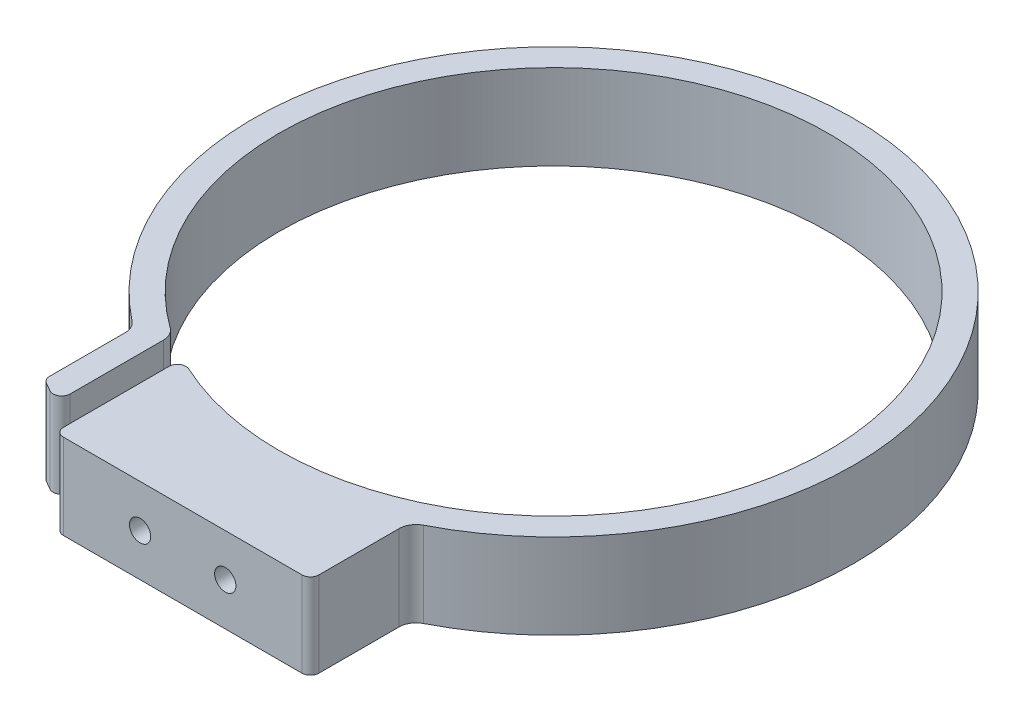
ISO-10303-21;
HEADER;
FILE_DESCRIPTION(('STEP AP214'),'2;1');
FILE_NAME('part.step','',(''),(''),'','','');
FILE_SCHEMA(('AUTOMOTIVE_DESIGN { 1 0 10303 214 1 1 1 1 }'));
ENDSEC;
DATA;
#1=APPLICATION_CONTEXT('core data for automotive mechanical design processes');
#2=APPLICATION_PROTOCOL_DEFINITION('international standard','automotive_design',2000,#1);
#3=PRODUCT_CONTEXT('',#1,'mechanical');
#4=PRODUCT('Part','Part','',(#3));
#5=PRODUCT_RELATED_PRODUCT_CATEGORY('part','',(#4));
#6=PRODUCT_DEFINITION_FORMATION('','',#4);
#7=PRODUCT_DEFINITION_CONTEXT('part definition',#1,'design');
#8=PRODUCT_DEFINITION('design','',#6,#7);
#9=PRODUCT_DEFINITION_SHAPE('','',#8);
#10=(LENGTH_UNIT() NAMED_UNIT(*) SI_UNIT(.MILLI.,.METRE.));
#11=(NAMED_UNIT(*) PLANE_ANGLE_UNIT() SI_UNIT($,.RADIAN.));
#12=(NAMED_UNIT(*) SI_UNIT($,.STERADIAN.) SOLID_ANGLE_UNIT());
#13=UNCERTAINTY_MEASURE_WITH_UNIT(LENGTH_MEASURE(1.E-05),#10,'distance_accuracy_value','');
#14=(GEOMETRIC_REPRESENTATION_CONTEXT(3) GLOBAL_UNCERTAINTY_ASSIGNED_CONTEXT((#13)) GLOBAL_UNIT_ASSIGNED_CONTEXT((#10,
#11,#12)) REPRESENTATION_CONTEXT('',''));
#15=CARTESIAN_POINT('',(0.,0.,0.));
#16=DIRECTION('',(0.,0.,1.));
#17=DIRECTION('',(1.,0.,0.));
#18=AXIS2_PLACEMENT_3D('',#15,#16,#17);
#19=CARTESIAN_POINT('',(0.,10.,0.));
#20=DIRECTION('',(0.,1.,0.));
#21=DIRECTION('',(0.,0.,1.));
#22=AXIS2_PLACEMENT_3D('',#19,#20,#21);
#23=PLANE('',#22);
#24=DIRECTION('',(1.,0.,0.));
#25=VECTOR('',#24,1.);
#26=CARTESIAN_POINT('',(-15.,10.,43.5492994660114));
#27=LINE('',#26,#25);
#28=CARTESIAN_POINT('',(-14.,10.,43.5492994660114));
#29=VERTEX_POINT('',#28);
#30=CARTESIAN_POINT('',(14.,10.,43.5492994660114));
#31=VERTEX_POINT('',#30);
#32=EDGE_CURVE('E213',#29,#31,#27,.T.);
#33=ORIENTED_EDGE('',*,*,#32,.T.);
#34=CARTESIAN_POINT('',(14.,10.,42.5492994660114));
#35=DIRECTION('',(0.,1.,0.));
#36=DIRECTION('',(0.,0.,1.));
#37=AXIS2_PLACEMENT_3D('',#34,#35,#36);
#38=CIRCLE('',#37,1.);
#39=CARTESIAN_POINT('',(15.,10.,42.5492994660114));
#40=VERTEX_POINT('',#39);
#41=EDGE_CURVE('E291',#31,#40,#38,.T.);
#42=ORIENTED_EDGE('',*,*,#41,.T.);
#43=DIRECTION('',(0.,0.,-1.));
#44=VECTOR('',#43,1.);
#45=CARTESIAN_POINT('',(15.,10.,43.5492994660114));
#46=LINE('',#45,#44);
#47=CARTESIAN_POINT('',(15.,10.,33.1445696909765));
#48=VERTEX_POINT('',#47);
#49=EDGE_CURVE('E216',#40,#48,#46,.T.);
#50=ORIENTED_EDGE('',*,*,#49,.T.);
#51=CARTESIAN_POINT('',(17.,10.,33.1445696909765));
#52=DIRECTION('',(0.,1.,0.));
#53=DIRECTION('',(0.,0.,1.));
#54=AXIS2_PLACEMENT_3D('',#51,#52,#53);
#55=CIRCLE('',#54,2.);
#56=CARTESIAN_POINT('',(16.0872483221477,10.,31.3649954793805));
#57=VERTEX_POINT('',#56);
#58=EDGE_CURVE('E261',#48,#57,#55,.F.);
#59=ORIENTED_EDGE('',*,*,#58,.T.);
#60=CARTESIAN_POINT('',(0.,10.,0.));
#61=DIRECTION('',(0.,1.,0.));
#62=DIRECTION('',(0.,0.,1.));
#63=AXIS2_PLACEMENT_3D('',#60,#61,#62);
#64=CIRCLE('',#63,35.25);
#65=CARTESIAN_POINT('',(-21.7651006711409,10.,27.728016387313));
#66=VERTEX_POINT('',#65);
#67=EDGE_CURVE('E219',#57,#66,#64,.T.);
#68=ORIENTED_EDGE('',*,*,#67,.T.);
#69=CARTESIAN_POINT('',(-23.,10.,29.3012371752457));
#70=DIRECTION('',(0.,1.,0.));
#71=DIRECTION('',(0.,0.,1.));
#72=AXIS2_PLACEMENT_3D('',#69,#70,#71);
#73=CIRCLE('',#72,2.);
#74=CARTESIAN_POINT('',(-21.,10.,29.3012371752457));
#75=VERTEX_POINT('',#74);
#76=EDGE_CURVE('E263',#66,#75,#73,.F.);
#77=ORIENTED_EDGE('',*,*,#76,.T.);
#78=DIRECTION('',(0.,0.,1.));
#79=VECTOR('',#78,1.);
#80=CARTESIAN_POINT('',(-21.,10.,26.7593441623669));
#81=LINE('',#80,#79);
#82=CARTESIAN_POINT('',(-21.,10.,38.1819938931773));
#83=VERTEX_POINT('',#82);
#84=EDGE_CURVE('E194',#75,#83,#81,.T.);
#85=ORIENTED_EDGE('',*,*,#84,.T.);
#86=CARTESIAN_POINT('',(-20.,10.,38.1819938931773));
#87=DIRECTION('',(0.,1.,0.));
#88=DIRECTION('',(0.,0.,1.));
#89=AXIS2_PLACEMENT_3D('',#86,#87,#88);
#90=CIRCLE('',#89,1.);
#91=CARTESIAN_POINT('',(-20.5,10.,39.0480192969617));
#92=VERTEX_POINT('',#91);
#93=EDGE_CURVE('E63',#83,#92,#90,.T.);
#94=ORIENTED_EDGE('',*,*,#93,.T.);
#95=DIRECTION('',(0.866025403784437,0.,0.500000000000002));
#96=VECTOR('',#95,1.);
#97=CARTESIAN_POINT('',(-18.,10.,40.4913949699358));
#98=LINE('',#97,#96);
#99=CARTESIAN_POINT('',(-19.5,10.,39.6253695661514));
#100=VERTEX_POINT('',#99);
#101=EDGE_CURVE('E198',#92,#100,#98,.T.);
#102=ORIENTED_EDGE('',*,*,#101,.T.);
#103=CARTESIAN_POINT('',(-19.,10.,38.7593441623669));
#104=DIRECTION('',(0.,1.,0.));
#105=DIRECTION('',(0.,0.,1.));
#106=AXIS2_PLACEMENT_3D('',#103,#104,#105);
#107=CIRCLE('',#106,1.);
#108=CARTESIAN_POINT('',(-18.,10.,38.7593441623669));
#109=VERTEX_POINT('',#108);
#110=EDGE_CURVE('E55',#100,#109,#107,.T.);
#111=ORIENTED_EDGE('',*,*,#110,.T.);
#112=DIRECTION('',(0.,0.,1.));
#113=VECTOR('',#112,1.);
#114=CARTESIAN_POINT('',(-18.,10.,31.8992554772051));
#115=LINE('',#114,#113);
#116=CARTESIAN_POINT('',(-18.,10.,27.804001510574));
#117=VERTEX_POINT('',#116);
#118=EDGE_CURVE('E201',#117,#109,#115,.T.);
#119=ORIENTED_EDGE('',*,*,#118,.F.);
#120=CARTESIAN_POINT('',(-20.,10.,27.804001510574));
#121=DIRECTION('',(0.,1.,0.));
#122=DIRECTION('',(0.,0.,1.));
#123=AXIS2_PLACEMENT_3D('',#120,#121,#122);
#124=CIRCLE('',#123,2.);
#125=CARTESIAN_POINT('',(-18.8321167883212,10.,26.1804101814894));
#126=VERTEX_POINT('',#125);
#127=EDGE_CURVE('E246',#117,#126,#124,.T.);
#128=ORIENTED_EDGE('',*,*,#127,.T.);
#129=CARTESIAN_POINT('',(0.,10.,0.));
#130=DIRECTION('',(0.,1.,0.));
#131=DIRECTION('',(0.,0.,1.));
#132=AXIS2_PLACEMENT_3D('',#129,#130,#131);
#133=CIRCLE('',#132,32.25);
#134=CARTESIAN_POINT('',(-13.5789473684211,10.,29.2519176869765));
#135=VERTEX_POINT('',#134);
#136=EDGE_CURVE('E209',#135,#126,#133,.T.);
#137=ORIENTED_EDGE('',*,*,#136,.F.);
#138=CARTESIAN_POINT('',(-14.,10.,30.1589538943247));
#139=DIRECTION('',(0.,1.,0.));
#140=DIRECTION('',(0.,0.,1.));
#141=AXIS2_PLACEMENT_3D('',#138,#139,#140);
#142=CIRCLE('',#141,1.);
#143=CARTESIAN_POINT('',(-15.,10.,30.1589538943247));
#144=VERTEX_POINT('',#143);
#145=EDGE_CURVE('E285',#135,#144,#142,.T.);
#146=ORIENTED_EDGE('',*,*,#145,.T.);
#147=DIRECTION('',(0.,0.,1.));
#148=VECTOR('',#147,1.);
#149=CARTESIAN_POINT('',(-15.,10.,31.8992554772051));
#150=LINE('',#149,#148);
#151=CARTESIAN_POINT('',(-15.,10.,42.5492994660114));
#152=VERTEX_POINT('',#151);
#153=EDGE_CURVE('E222',#144,#152,#150,.T.);
#154=ORIENTED_EDGE('',*,*,#153,.T.);
#155=CARTESIAN_POINT('',(-14.,10.,42.5492994660114));
#156=DIRECTION('',(0.,1.,0.));
#157=DIRECTION('',(0.,0.,1.));
#158=AXIS2_PLACEMENT_3D('',#155,#156,#157);
#159=CIRCLE('',#158,1.);
#160=EDGE_CURVE('E289',#152,#29,#159,.T.);
#161=ORIENTED_EDGE('',*,*,#160,.T.);
#162=EDGE_LOOP('',(#33,#42,#50,#59,#68,#77,#85,#94,#102,#111,#119,#128,#137,#146,#154,#161));
#163=FACE_BOUND('',#162,.T.);
#164=ADVANCED_FACE('F40',(#163),#23,.T.);
#165=CARTESIAN_POINT('',(0.,0.,0.));
#166=DIRECTION('',(0.,1.,0.));
#167=DIRECTION('',(0.,0.,1.));
#168=AXIS2_PLACEMENT_3D('',#165,#166,#167);
#169=PLANE('',#168);
#170=DIRECTION('',(0.,0.,-1.));
#171=VECTOR('',#170,1.);
#172=CARTESIAN_POINT('',(15.,0.,43.5492994660114));
#173=LINE('',#172,#171);
#174=CARTESIAN_POINT('',(15.,0.,42.5492994660114));
#175=VERTEX_POINT('',#174);
#176=CARTESIAN_POINT('',(15.,0.,33.1445696909765));
#177=VERTEX_POINT('',#176);
#178=EDGE_CURVE('E228',#175,#177,#173,.T.);
#179=ORIENTED_EDGE('',*,*,#178,.F.);
#180=CARTESIAN_POINT('',(14.,0.,42.5492994660114));
#181=DIRECTION('',(0.,1.,0.));
#182=DIRECTION('',(0.,0.,1.));
#183=AXIS2_PLACEMENT_3D('',#180,#181,#182);
#184=CIRCLE('',#183,1.);
#185=CARTESIAN_POINT('',(14.,0.,43.5492994660114));
#186=VERTEX_POINT('',#185);
#187=EDGE_CURVE('E278',#175,#186,#184,.F.);
#188=ORIENTED_EDGE('',*,*,#187,.T.);
#189=DIRECTION('',(1.,0.,0.));
#190=VECTOR('',#189,1.);
#191=CARTESIAN_POINT('',(-15.,0.,43.5492994660114));
#192=LINE('',#191,#190);
#193=CARTESIAN_POINT('',(-14.,0.,43.5492994660114));
#194=VERTEX_POINT('',#193);
#195=EDGE_CURVE('E211',#194,#186,#192,.T.);
#196=ORIENTED_EDGE('',*,*,#195,.F.);
#197=CARTESIAN_POINT('',(-14.,0.,42.5492994660114));
#198=DIRECTION('',(0.,1.,0.));
#199=DIRECTION('',(0.,0.,1.));
#200=AXIS2_PLACEMENT_3D('',#197,#198,#199);
#201=CIRCLE('',#200,1.);
#202=CARTESIAN_POINT('',(-15.,0.,42.5492994660114));
#203=VERTEX_POINT('',#202);
#204=EDGE_CURVE('E276',#194,#203,#201,.F.);
#205=ORIENTED_EDGE('',*,*,#204,.T.);
#206=DIRECTION('',(0.,0.,1.));
#207=VECTOR('',#206,1.);
#208=CARTESIAN_POINT('',(-15.,0.,31.8992554772051));
#209=LINE('',#208,#207);
#210=CARTESIAN_POINT('',(-15.,0.,30.1589538943247));
#211=VERTEX_POINT('',#210);
#212=EDGE_CURVE('E217',#211,#203,#209,.T.);
#213=ORIENTED_EDGE('',*,*,#212,.F.);
#214=CARTESIAN_POINT('',(-14.,0.,30.1589538943247));
#215=DIRECTION('',(0.,1.,0.));
#216=DIRECTION('',(0.,0.,1.));
#217=AXIS2_PLACEMENT_3D('',#214,#215,#216);
#218=CIRCLE('',#217,1.);
#219=CARTESIAN_POINT('',(-13.5789473684211,0.,29.2519176869765));
#220=VERTEX_POINT('',#219);
#221=EDGE_CURVE('E270',#211,#220,#218,.F.);
#222=ORIENTED_EDGE('',*,*,#221,.T.);
#223=CARTESIAN_POINT('',(0.,0.,0.));
#224=DIRECTION('',(0.,1.,0.));
#225=DIRECTION('',(0.,0.,1.));
#226=AXIS2_PLACEMENT_3D('',#223,#224,#225);
#227=CIRCLE('',#226,32.25);
#228=CARTESIAN_POINT('',(-18.8321167883212,0.,26.1804101814894));
#229=VERTEX_POINT('',#228);
#230=EDGE_CURVE('E206',#220,#229,#227,.T.);
#231=ORIENTED_EDGE('',*,*,#230,.T.);
#232=CARTESIAN_POINT('',(-20.,0.,27.804001510574));
#233=DIRECTION('',(0.,1.,0.));
#234=DIRECTION('',(0.,0.,1.));
#235=AXIS2_PLACEMENT_3D('',#232,#233,#234);
#236=CIRCLE('',#235,2.);
#237=CARTESIAN_POINT('',(-18.,0.,27.804001510574));
#238=VERTEX_POINT('',#237);
#239=EDGE_CURVE('E252',#229,#238,#236,.F.);
#240=ORIENTED_EDGE('',*,*,#239,.T.);
#241=DIRECTION('',(0.,0.,-1.));
#242=VECTOR('',#241,1.);
#243=CARTESIAN_POINT('',(-18.,0.,31.8992554772051));
#244=LINE('',#243,#242);
#245=CARTESIAN_POINT('',(-18.,0.,38.7593441623669));
#246=VERTEX_POINT('',#245);
#247=EDGE_CURVE('E204',#246,#238,#244,.T.);
#248=ORIENTED_EDGE('',*,*,#247,.F.);
#249=CARTESIAN_POINT('',(-19.,0.,38.7593441623669));
#250=DIRECTION('',(0.,1.,0.));
#251=DIRECTION('',(0.,0.,1.));
#252=AXIS2_PLACEMENT_3D('',#249,#250,#251);
#253=CIRCLE('',#252,1.);
#254=CARTESIAN_POINT('',(-19.5,0.,39.6253695661514));
#255=VERTEX_POINT('',#254);
#256=EDGE_CURVE('E274',#246,#255,#253,.F.);
#257=ORIENTED_EDGE('',*,*,#256,.T.);
#258=DIRECTION('',(-0.866025403784438,0.,-0.500000000000002));
#259=VECTOR('',#258,1.);
#260=CARTESIAN_POINT('',(-18.,0.,40.4913949699358));
#261=LINE('',#260,#259);
#262=CARTESIAN_POINT('',(-20.5,0.,39.0480192969617));
#263=VERTEX_POINT('',#262);
#264=EDGE_CURVE('E197',#255,#263,#261,.T.);
#265=ORIENTED_EDGE('',*,*,#264,.T.);
#266=CARTESIAN_POINT('',(-20.,0.,38.1819938931773));
#267=DIRECTION('',(0.,1.,0.));
#268=DIRECTION('',(0.,0.,1.));
#269=AXIS2_PLACEMENT_3D('',#266,#267,#268);
#270=CIRCLE('',#269,1.);
#271=CARTESIAN_POINT('',(-21.,0.,38.1819938931773));
#272=VERTEX_POINT('',#271);
#273=EDGE_CURVE('E272',#263,#272,#270,.F.);
#274=ORIENTED_EDGE('',*,*,#273,.T.);
#275=DIRECTION('',(0.,0.,-1.));
#276=VECTOR('',#275,1.);
#277=CARTESIAN_POINT('',(-21.,0.,26.7593441623669));
#278=LINE('',#277,#276);
#279=CARTESIAN_POINT('',(-21.,0.,29.3012371752457));
#280=VERTEX_POINT('',#279);
#281=EDGE_CURVE('E195',#272,#280,#278,.T.);
#282=ORIENTED_EDGE('',*,*,#281,.T.);
#283=CARTESIAN_POINT('',(-23.,0.,29.3012371752457));
#284=DIRECTION('',(0.,1.,0.));
#285=DIRECTION('',(0.,0.,1.));
#286=AXIS2_PLACEMENT_3D('',#283,#284,#285);
#287=CIRCLE('',#286,2.);
#288=CARTESIAN_POINT('',(-21.7651006711409,0.,27.728016387313));
#289=VERTEX_POINT('',#288);
#290=EDGE_CURVE('E265',#280,#289,#287,.T.);
#291=ORIENTED_EDGE('',*,*,#290,.T.);
#292=CARTESIAN_POINT('',(0.,0.,0.));
#293=DIRECTION('',(0.,1.,0.));
#294=DIRECTION('',(0.,0.,1.));
#295=AXIS2_PLACEMENT_3D('',#292,#293,#294);
#296=CIRCLE('',#295,35.25);
#297=CARTESIAN_POINT('',(16.0872483221477,0.,31.3649954793805));
#298=VERTEX_POINT('',#297);
#299=EDGE_CURVE('E230',#298,#289,#296,.T.);
#300=ORIENTED_EDGE('',*,*,#299,.F.);
#301=CARTESIAN_POINT('',(17.,0.,33.1445696909765));
#302=DIRECTION('',(0.,1.,0.));
#303=DIRECTION('',(0.,0.,1.));
#304=AXIS2_PLACEMENT_3D('',#301,#302,#303);
#305=CIRCLE('',#304,2.);
#306=EDGE_CURVE('E258',#298,#177,#305,.T.);
#307=ORIENTED_EDGE('',*,*,#306,.T.);
#308=EDGE_LOOP('',(#179,#188,#196,#205,#213,#222,#231,#240,#248,#257,#265,#274,#282,#291,#300,#307));
#309=FACE_BOUND('',#308,.T.);
#310=ADVANCED_FACE('F323',(#309),#169,.F.);
#311=CARTESIAN_POINT('',(-15.,10.,43.5492994660114));
#312=DIRECTION('',(0.,0.,-1.));
#313=DIRECTION('',(-1.,0.,0.));
#314=AXIS2_PLACEMENT_3D('',#311,#312,#313);
#315=PLANE('',#314);
#316=CARTESIAN_POINT('',(-5.,5.,43.5492994660114));
#317=DIRECTION('',(0.,0.,1.));
#318=DIRECTION('',(1.,0.,0.));
#319=AXIS2_PLACEMENT_3D('',#316,#317,#318);
#320=CIRCLE('',#319,1.24999999999999);
#321=CARTESIAN_POINT('',(-3.75000000000001,5.,43.5492994660114));
#322=VERTEX_POINT('',#321);
#323=EDGE_CURVE('E172',#322,#322,#320,.T.);
#324=ORIENTED_EDGE('',*,*,#323,.F.);
#325=EDGE_LOOP('',(#324));
#326=FACE_BOUND('',#325,.T.);
#327=CARTESIAN_POINT('',(5.,5.,43.5492994660114));
#328=DIRECTION('',(0.,0.,1.));
#329=DIRECTION('',(1.,0.,0.));
#330=AXIS2_PLACEMENT_3D('',#327,#328,#329);
#331=CIRCLE('',#330,1.24999999999999);
#332=CARTESIAN_POINT('',(6.24999999999999,5.,43.5492994660114));
#333=VERTEX_POINT('',#332);
#334=EDGE_CURVE('E171',#333,#333,#331,.T.);
#335=ORIENTED_EDGE('',*,*,#334,.F.);
#336=EDGE_LOOP('',(#335));
#337=FACE_BOUND('',#336,.T.);
#338=ORIENTED_EDGE('',*,*,#195,.T.);
#339=DIRECTION('',(0.,-1.,0.));
#340=VECTOR('',#339,1.);
#341=CARTESIAN_POINT('',(14.,10.,43.5492994660114));
#342=LINE('',#341,#340);
#343=EDGE_CURVE('E283',#186,#31,#342,.F.);
#344=ORIENTED_EDGE('',*,*,#343,.T.);
#345=ORIENTED_EDGE('',*,*,#32,.F.);
#346=DIRECTION('',(0.,-1.,0.));
#347=VECTOR('',#346,1.);
#348=CARTESIAN_POINT('',(-14.,10.,43.5492994660114));
#349=LINE('',#348,#347);
#350=EDGE_CURVE('E280',#29,#194,#349,.T.);
#351=ORIENTED_EDGE('',*,*,#350,.T.);
#352=EDGE_LOOP('',(#338,#344,#345,#351));
#353=FACE_BOUND('',#352,.T.);
#354=ADVANCED_FACE('F360',(#326,#337,#353),#315,.F.);
#355=CARTESIAN_POINT('',(15.,10.,43.5492994660114));
#356=DIRECTION('',(-1.,0.,0.));
#357=DIRECTION('',(0.,0.,1.));
#358=AXIS2_PLACEMENT_3D('',#355,#356,#357);
#359=PLANE('',#358);
#360=ORIENTED_EDGE('',*,*,#49,.F.);
#361=DIRECTION('',(0.,-1.,0.));
#362=VECTOR('',#361,1.);
#363=CARTESIAN_POINT('',(15.,10.,42.5492994660114));
#364=LINE('',#363,#362);
#365=EDGE_CURVE('E267',#40,#175,#364,.T.);
#366=ORIENTED_EDGE('',*,*,#365,.T.);
#367=ORIENTED_EDGE('',*,*,#178,.T.);
#368=DIRECTION('',(0.,1.,0.));
#369=VECTOR('',#368,1.);
#370=CARTESIAN_POINT('',(15.,10.,33.1445696909765));
#371=LINE('',#370,#369);
#372=EDGE_CURVE('E240',#177,#48,#371,.T.);
#373=ORIENTED_EDGE('',*,*,#372,.T.);
#374=EDGE_LOOP('',(#360,#366,#367,#373));
#375=FACE_BOUND('',#374,.T.);
#376=ADVANCED_FACE('F368',(#375),#359,.F.);
#377=CARTESIAN_POINT('',(0.,10.,0.));
#378=DIRECTION('',(0.,-1.,0.));
#379=DIRECTION('',(0.,0.,-1.));
#380=AXIS2_PLACEMENT_3D('',#377,#378,#379);
#381=CYLINDRICAL_SURFACE('',#380,35.25);
#382=ORIENTED_EDGE('',*,*,#67,.F.);
#383=DIRECTION('',(0.,-1.,0.));
#384=VECTOR('',#383,1.);
#385=CARTESIAN_POINT('',(16.0872483221477,10.,31.3649954793805));
#386=LINE('',#385,#384);
#387=EDGE_CURVE('E237',#57,#298,#386,.T.);
#388=ORIENTED_EDGE('',*,*,#387,.T.);
#389=ORIENTED_EDGE('',*,*,#299,.T.);
#390=DIRECTION('',(0.,-1.,0.));
#391=VECTOR('',#390,1.);
#392=CARTESIAN_POINT('',(-21.7651006711409,10.,27.728016387313));
#393=LINE('',#392,#391);
#394=EDGE_CURVE('E225',#289,#66,#393,.F.);
#395=ORIENTED_EDGE('',*,*,#394,.T.);
#396=EDGE_LOOP('',(#382,#388,#389,#395));
#397=FACE_BOUND('',#396,.T.);
#398=ADVANCED_FACE('F318',(#397),#381,.T.);
#399=CARTESIAN_POINT('',(-15.,10.,31.8992554772051));
#400=DIRECTION('',(1.,0.,0.));
#401=DIRECTION('',(0.,0.,-1.));
#402=AXIS2_PLACEMENT_3D('',#399,#400,#401);
#403=PLANE('',#402);
#404=CARTESIAN_POINT('',(-15.,5.,33.7593441623669));
#405=DIRECTION('',(-1.,0.,0.));
#406=DIRECTION('',(0.,0.,1.));
#407=AXIS2_PLACEMENT_3D('',#404,#405,#406);
#408=CIRCLE('',#407,1.25);
#409=CARTESIAN_POINT('',(-15.,5.,35.0093441623669));
#410=VERTEX_POINT('',#409);
#411=EDGE_CURVE('E182',#410,#410,#408,.T.);
#412=ORIENTED_EDGE('',*,*,#411,.F.);
#413=EDGE_LOOP('',(#412));
#414=FACE_BOUND('',#413,.T.);
#415=ORIENTED_EDGE('',*,*,#212,.T.);
#416=DIRECTION('',(0.,-1.,0.));
#417=VECTOR('',#416,1.);
#418=CARTESIAN_POINT('',(-15.,10.,42.5492994660114));
#419=LINE('',#418,#417);
#420=EDGE_CURVE('E296',#203,#152,#419,.F.);
#421=ORIENTED_EDGE('',*,*,#420,.T.);
#422=ORIENTED_EDGE('',*,*,#153,.F.);
#423=DIRECTION('',(0.,1.,0.));
#424=VECTOR('',#423,1.);
#425=CARTESIAN_POINT('',(-15.,0.,30.1589538943247));
#426=LINE('',#425,#424);
#427=EDGE_CURVE('E293',#144,#211,#426,.F.);
#428=ORIENTED_EDGE('',*,*,#427,.T.);
#429=EDGE_LOOP('',(#415,#421,#422,#428));
#430=FACE_BOUND('',#429,.T.);
#431=ADVANCED_FACE('F351',(#414,#430),#403,.F.);
#432=CARTESIAN_POINT('',(0.,10.,0.));
#433=DIRECTION('',(0.,-1.,0.));
#434=DIRECTION('',(0.,0.,-1.));
#435=AXIS2_PLACEMENT_3D('',#432,#433,#434);
#436=CYLINDRICAL_SURFACE('',#435,32.25);
#437=ORIENTED_EDGE('',*,*,#230,.F.);
#438=DIRECTION('',(0.,-1.,0.));
#439=VECTOR('',#438,1.);
#440=CARTESIAN_POINT('',(-13.578947368421,10.,29.2519176869765));
#441=LINE('',#440,#439);
#442=EDGE_CURVE('E11',#220,#135,#441,.F.);
#443=ORIENTED_EDGE('',*,*,#442,.T.);
#444=ORIENTED_EDGE('',*,*,#136,.T.);
#445=DIRECTION('',(0.,-1.,0.));
#446=VECTOR('',#445,1.);
#447=CARTESIAN_POINT('',(-18.8321167883212,10.,26.1804101814894));
#448=LINE('',#447,#446);
#449=EDGE_CURVE('E249',#126,#229,#448,.T.);
#450=ORIENTED_EDGE('',*,*,#449,.T.);
#451=EDGE_LOOP('',(#437,#443,#444,#450));
#452=FACE_BOUND('',#451,.T.);
#453=ADVANCED_FACE('F388',(#452),#436,.F.);
#454=CARTESIAN_POINT('',(-18.,-8.71908682983813,31.8992554772051));
#455=DIRECTION('',(-1.,0.,0.));
#456=DIRECTION('',(0.,0.,1.));
#457=AXIS2_PLACEMENT_3D('',#454,#455,#456);
#458=PLANE('',#457);
#459=CARTESIAN_POINT('',(-18.,5.,33.7593441623669));
#460=DIRECTION('',(-1.,0.,0.));
#461=DIRECTION('',(0.,0.,1.));
#462=AXIS2_PLACEMENT_3D('',#459,#460,#461);
#463=CIRCLE('',#462,1.7);
#464=CARTESIAN_POINT('',(-18.,5.,35.4593441623669));
#465=VERTEX_POINT('',#464);
#466=EDGE_CURVE('E191',#465,#465,#463,.T.);
#467=ORIENTED_EDGE('',*,*,#466,.T.);
#468=EDGE_LOOP('',(#467));
#469=FACE_BOUND('',#468,.T.);
#470=ORIENTED_EDGE('',*,*,#118,.T.);
#471=DIRECTION('',(0.,1.,0.));
#472=VECTOR('',#471,1.);
#473=CARTESIAN_POINT('',(-18.,0.,38.7593441623669));
#474=LINE('',#473,#472);
#475=EDGE_CURVE('E302',#109,#246,#474,.F.);
#476=ORIENTED_EDGE('',*,*,#475,.T.);
#477=ORIENTED_EDGE('',*,*,#247,.T.);
#478=DIRECTION('',(0.,1.,0.));
#479=VECTOR('',#478,1.);
#480=CARTESIAN_POINT('',(-18.,10.,27.804001510574));
#481=LINE('',#480,#479);
#482=EDGE_CURVE('E243',#238,#117,#481,.T.);
#483=ORIENTED_EDGE('',*,*,#482,.T.);
#484=EDGE_LOOP('',(#470,#476,#477,#483));
#485=FACE_BOUND('',#484,.T.);
#486=ADVANCED_FACE('F332',(#469,#485),#458,.F.);
#487=CARTESIAN_POINT('',(-21.,-14.0559318218912,26.7593441623669));
#488=DIRECTION('',(-1.,0.,0.));
#489=DIRECTION('',(0.,0.,1.));
#490=AXIS2_PLACEMENT_3D('',#487,#488,#489);
#491=PLANE('',#490);
#492=CARTESIAN_POINT('',(-21.,5.,33.7593441623669));
#493=DIRECTION('',(-1.,0.,0.));
#494=DIRECTION('',(0.,0.,1.));
#495=AXIS2_PLACEMENT_3D('',#492,#493,#494);
#496=CIRCLE('',#495,1.7);
#497=CARTESIAN_POINT('',(-21.,5.,35.4593441623669));
#498=VERTEX_POINT('',#497);
#499=EDGE_CURVE('E188',#498,#498,#496,.T.);
#500=ORIENTED_EDGE('',*,*,#499,.F.);
#501=EDGE_LOOP('',(#500));
#502=FACE_BOUND('',#501,.T.);
#503=ORIENTED_EDGE('',*,*,#281,.F.);
#504=DIRECTION('',(0.,1.,0.));
#505=VECTOR('',#504,1.);
#506=CARTESIAN_POINT('',(-21.,-14.0559318218912,38.1819938931773));
#507=LINE('',#506,#505);
#508=EDGE_CURVE('E48',#272,#83,#507,.T.);
#509=ORIENTED_EDGE('',*,*,#508,.T.);
#510=ORIENTED_EDGE('',*,*,#84,.F.);
#511=DIRECTION('',(0.,-1.,0.));
#512=VECTOR('',#511,1.);
#513=CARTESIAN_POINT('',(-21.,-14.0559318218912,29.3012371752457));
#514=LINE('',#513,#512);
#515=EDGE_CURVE('E255',#75,#280,#514,.T.);
#516=ORIENTED_EDGE('',*,*,#515,.T.);
#517=EDGE_LOOP('',(#503,#509,#510,#516));
#518=FACE_BOUND('',#517,.T.);
#519=ADVANCED_FACE('F308',(#502,#518),#491,.T.);
#520=CARTESIAN_POINT('',(-18.,-14.0559318218912,40.4913949699358));
#521=DIRECTION('',(-0.500000000000002,0.,0.866025403784438));
#522=DIRECTION('',(0.866025403784438,0.,0.500000000000002));
#523=AXIS2_PLACEMENT_3D('',#520,#521,#522);
#524=PLANE('',#523);
#525=ORIENTED_EDGE('',*,*,#264,.F.);
#526=DIRECTION('',(0.,1.,0.));
#527=VECTOR('',#526,1.);
#528=CARTESIAN_POINT('',(-19.5,10.,39.6253695661514));
#529=LINE('',#528,#527);
#530=EDGE_CURVE('E300',#255,#100,#529,.T.);
#531=ORIENTED_EDGE('',*,*,#530,.T.);
#532=ORIENTED_EDGE('',*,*,#101,.F.);
#533=DIRECTION('',(0.,1.,0.));
#534=VECTOR('',#533,1.);
#535=CARTESIAN_POINT('',(-20.5,-14.0559318218912,39.0480192969617));
#536=LINE('',#535,#534);
#537=EDGE_CURVE('E298',#92,#263,#536,.F.);
#538=ORIENTED_EDGE('',*,*,#537,.T.);
#539=EDGE_LOOP('',(#525,#531,#532,#538));
#540=FACE_BOUND('',#539,.T.);
#541=ADVANCED_FACE('F329',(#540),#524,.T.);
#542=CARTESIAN_POINT('',(-21.,5.,33.7593441623669));
#543=DIRECTION('',(-1.,0.,0.));
#544=DIRECTION('',(0.,0.,1.));
#545=AXIS2_PLACEMENT_3D('',#542,#543,#544);
#546=CYLINDRICAL_SURFACE('',#545,1.7);
#547=ORIENTED_EDGE('',*,*,#466,.F.);
#548=EDGE_LOOP('',(#547));
#549=FACE_BOUND('',#548,.T.);
#550=ORIENTED_EDGE('',*,*,#499,.T.);
#551=EDGE_LOOP('',(#550));
#552=FACE_BOUND('',#551,.T.);
#553=ADVANCED_FACE('F423',(#549,#552),#546,.F.);
#554=CARTESIAN_POINT('',(-6.5,5.,33.7593441623669));
#555=DIRECTION('',(-1.,0.,0.));
#556=DIRECTION('',(0.,0.,1.));
#557=AXIS2_PLACEMENT_3D('',#554,#555,#556);
#558=CONICAL_SURFACE('',#557,1.25,1.02974425867665);
#559=CARTESIAN_POINT('',(-5.74892422621555,5.,33.7593441623669));
#560=VERTEX_POINT('',#559);
#561=VERTEX_LOOP('',#560);
#562=FACE_BOUND('',#561,.T.);
#563=CARTESIAN_POINT('',(-6.5,5.,33.7593441623669));
#564=DIRECTION('',(-1.,0.,0.));
#565=DIRECTION('',(0.,0.,1.));
#566=AXIS2_PLACEMENT_3D('',#563,#564,#565);
#567=CIRCLE('',#566,1.25);
#568=CARTESIAN_POINT('',(-6.5,5.,35.0093441623669));
#569=VERTEX_POINT('',#568);
#570=EDGE_CURVE('E185',#569,#569,#567,.T.);
#571=ORIENTED_EDGE('',*,*,#570,.T.);
#572=EDGE_LOOP('',(#571));
#573=FACE_BOUND('',#572,.T.);
#574=ADVANCED_FACE('F419',(#562,#573),#558,.F.);
#575=CARTESIAN_POINT('',(-15.,5.,33.7593441623669));
#576=DIRECTION('',(-1.,0.,0.));
#577=DIRECTION('',(0.,0.,1.));
#578=AXIS2_PLACEMENT_3D('',#575,#576,#577);
#579=CYLINDRICAL_SURFACE('',#578,1.25);
#580=ORIENTED_EDGE('',*,*,#570,.F.);
#581=EDGE_LOOP('',(#580));
#582=FACE_BOUND('',#581,.T.);
#583=ORIENTED_EDGE('',*,*,#411,.T.);
#584=EDGE_LOOP('',(#583));
#585=FACE_BOUND('',#584,.T.);
#586=ADVANCED_FACE('F412',(#582,#585),#579,.F.);
#587=CARTESIAN_POINT('',(5.,5.,35.0492994660114));
#588=DIRECTION('',(0.,0.,1.));
#589=DIRECTION('',(1.,0.,0.));
#590=AXIS2_PLACEMENT_3D('',#587,#588,#589);
#591=CONICAL_SURFACE('',#590,1.25,1.02974425867665);
#592=CARTESIAN_POINT('',(5.,5.,34.298223692227));
#593=VERTEX_POINT('',#592);
#594=VERTEX_LOOP('',#593);
#595=FACE_BOUND('',#594,.T.);
#596=CARTESIAN_POINT('',(5.,5.,35.0492994660114));
#597=DIRECTION('',(0.,0.,1.));
#598=DIRECTION('',(1.,0.,0.));
#599=AXIS2_PLACEMENT_3D('',#596,#597,#598);
#600=CIRCLE('',#599,1.25);
#601=CARTESIAN_POINT('',(6.25,5.,35.0492994660114));
#602=VERTEX_POINT('',#601);
#603=EDGE_CURVE('E175',#602,#602,#600,.T.);
#604=ORIENTED_EDGE('',*,*,#603,.T.);
#605=EDGE_LOOP('',(#604));
#606=FACE_BOUND('',#605,.T.);
#607=ADVANCED_FACE('F406',(#595,#606),#591,.F.);
#608=CARTESIAN_POINT('',(5.,5.,43.5492994660114));
#609=DIRECTION('',(0.,0.,1.));
#610=DIRECTION('',(1.,0.,0.));
#611=AXIS2_PLACEMENT_3D('',#608,#609,#610);
#612=CYLINDRICAL_SURFACE('',#611,1.24999999999999);
#613=ORIENTED_EDGE('',*,*,#603,.F.);
#614=EDGE_LOOP('',(#613));
#615=FACE_BOUND('',#614,.T.);
#616=ORIENTED_EDGE('',*,*,#334,.T.);
#617=EDGE_LOOP('',(#616));
#618=FACE_BOUND('',#617,.T.);
#619=ADVANCED_FACE('F165',(#615,#618),#612,.F.);
#620=CARTESIAN_POINT('',(-5.,5.,35.0492994660114));
#621=DIRECTION('',(0.,0.,1.));
#622=DIRECTION('',(1.,0.,0.));
#623=AXIS2_PLACEMENT_3D('',#620,#621,#622);
#624=CONICAL_SURFACE('',#623,1.25,1.02974425867665);
#625=CARTESIAN_POINT('',(-5.,5.,34.298223692227));
#626=VERTEX_POINT('',#625);
#627=VERTEX_LOOP('',#626);
#628=FACE_BOUND('',#627,.T.);
#629=CARTESIAN_POINT('',(-5.,5.,35.0492994660114));
#630=DIRECTION('',(0.,0.,1.));
#631=DIRECTION('',(1.,0.,0.));
#632=AXIS2_PLACEMENT_3D('',#629,#630,#631);
#633=CIRCLE('',#632,1.25);
#634=CARTESIAN_POINT('',(-3.75,5.,35.0492994660114));
#635=VERTEX_POINT('',#634);
#636=EDGE_CURVE('E169',#635,#635,#633,.T.);
#637=ORIENTED_EDGE('',*,*,#636,.T.);
#638=EDGE_LOOP('',(#637));
#639=FACE_BOUND('',#638,.T.);
#640=ADVANCED_FACE('F161',(#628,#639),#624,.F.);
#641=CARTESIAN_POINT('',(-5.,5.,43.5492994660114));
#642=DIRECTION('',(0.,0.,1.));
#643=DIRECTION('',(1.,0.,0.));
#644=AXIS2_PLACEMENT_3D('',#641,#642,#643);
#645=CYLINDRICAL_SURFACE('',#644,1.24999999999999);
#646=ORIENTED_EDGE('',*,*,#636,.F.);
#647=EDGE_LOOP('',(#646));
#648=FACE_BOUND('',#647,.T.);
#649=ORIENTED_EDGE('',*,*,#323,.T.);
#650=EDGE_LOOP('',(#649));
#651=FACE_BOUND('',#650,.T.);
#652=ADVANCED_FACE('F164',(#648,#651),#645,.F.);
#653=CARTESIAN_POINT('',(17.,10.,33.1445696909765));
#654=DIRECTION('',(0.,-1.,0.));
#655=DIRECTION('',(0.,0.,-1.));
#656=AXIS2_PLACEMENT_3D('',#653,#654,#655);
#657=CYLINDRICAL_SURFACE('',#656,2.);
#658=ORIENTED_EDGE('',*,*,#58,.F.);
#659=ORIENTED_EDGE('',*,*,#372,.F.);
#660=ORIENTED_EDGE('',*,*,#306,.F.);
#661=ORIENTED_EDGE('',*,*,#387,.F.);
#662=EDGE_LOOP('',(#658,#659,#660,#661));
#663=FACE_BOUND('',#662,.T.);
#664=ADVANCED_FACE('F371',(#663),#657,.F.);
#665=CARTESIAN_POINT('',(-20.,10.,27.804001510574));
#666=DIRECTION('',(0.,-1.,0.));
#667=DIRECTION('',(0.,0.,-1.));
#668=AXIS2_PLACEMENT_3D('',#665,#666,#667);
#669=CYLINDRICAL_SURFACE('',#668,2.);
#670=ORIENTED_EDGE('',*,*,#239,.F.);
#671=ORIENTED_EDGE('',*,*,#449,.F.);
#672=ORIENTED_EDGE('',*,*,#127,.F.);
#673=ORIENTED_EDGE('',*,*,#482,.F.);
#674=EDGE_LOOP('',(#670,#671,#672,#673));
#675=FACE_BOUND('',#674,.T.);
#676=ADVANCED_FACE('F341',(#675),#669,.T.);
#677=CARTESIAN_POINT('',(-23.,10.,29.3012371752457));
#678=DIRECTION('',(0.,-1.,0.));
#679=DIRECTION('',(0.,0.,-1.));
#680=AXIS2_PLACEMENT_3D('',#677,#678,#679);
#681=CYLINDRICAL_SURFACE('',#680,2.);
#682=ORIENTED_EDGE('',*,*,#290,.F.);
#683=ORIENTED_EDGE('',*,*,#515,.F.);
#684=ORIENTED_EDGE('',*,*,#76,.F.);
#685=ORIENTED_EDGE('',*,*,#394,.F.);
#686=EDGE_LOOP('',(#682,#683,#684,#685));
#687=FACE_BOUND('',#686,.T.);
#688=ADVANCED_FACE('F316',(#687),#681,.F.);
#689=CARTESIAN_POINT('',(14.,10.,42.5492994660114));
#690=DIRECTION('',(0.,-1.,0.));
#691=DIRECTION('',(0.,0.,-1.));
#692=AXIS2_PLACEMENT_3D('',#689,#690,#691);
#693=CYLINDRICAL_SURFACE('',#692,1.);
#694=ORIENTED_EDGE('',*,*,#41,.F.);
#695=ORIENTED_EDGE('',*,*,#343,.F.);
#696=ORIENTED_EDGE('',*,*,#187,.F.);
#697=ORIENTED_EDGE('',*,*,#365,.F.);
#698=EDGE_LOOP('',(#694,#695,#696,#697));
#699=FACE_BOUND('',#698,.T.);
#700=ADVANCED_FACE('F366',(#699),#693,.T.);
#701=CARTESIAN_POINT('',(-14.,10.,42.5492994660114));
#702=DIRECTION('',(0.,-1.,0.));
#703=DIRECTION('',(0.,0.,-1.));
#704=AXIS2_PLACEMENT_3D('',#701,#702,#703);
#705=CYLINDRICAL_SURFACE('',#704,1.);
#706=ORIENTED_EDGE('',*,*,#160,.F.);
#707=ORIENTED_EDGE('',*,*,#420,.F.);
#708=ORIENTED_EDGE('',*,*,#204,.F.);
#709=ORIENTED_EDGE('',*,*,#350,.F.);
#710=EDGE_LOOP('',(#706,#707,#708,#709));
#711=FACE_BOUND('',#710,.T.);
#712=ADVANCED_FACE('F357',(#711),#705,.T.);
#713=CARTESIAN_POINT('',(-19.,-14.0559318218912,38.7593441623669));
#714=DIRECTION('',(0.,-1.,0.));
#715=DIRECTION('',(0.,0.,-1.));
#716=AXIS2_PLACEMENT_3D('',#713,#714,#715);
#717=CYLINDRICAL_SURFACE('',#716,1.);
#718=ORIENTED_EDGE('',*,*,#256,.F.);
#719=ORIENTED_EDGE('',*,*,#475,.F.);
#720=ORIENTED_EDGE('',*,*,#110,.F.);
#721=ORIENTED_EDGE('',*,*,#530,.F.);
#722=EDGE_LOOP('',(#718,#719,#720,#721));
#723=FACE_BOUND('',#722,.T.);
#724=ADVANCED_FACE('F336',(#723),#717,.T.);
#725=CARTESIAN_POINT('',(-20.,-14.0559318218912,38.1819938931773));
#726=DIRECTION('',(0.,1.,0.));
#727=DIRECTION('',(0.,0.,1.));
#728=AXIS2_PLACEMENT_3D('',#725,#726,#727);
#729=CYLINDRICAL_SURFACE('',#728,1.);
#730=ORIENTED_EDGE('',*,*,#273,.F.);
#731=ORIENTED_EDGE('',*,*,#537,.F.);
#732=ORIENTED_EDGE('',*,*,#93,.F.);
#733=ORIENTED_EDGE('',*,*,#508,.F.);
#734=EDGE_LOOP('',(#730,#731,#732,#733));
#735=FACE_BOUND('',#734,.T.);
#736=ADVANCED_FACE('F327',(#735),#729,.T.);
#737=CARTESIAN_POINT('',(-14.,10.,30.1589538943247));
#738=DIRECTION('',(0.,-1.,0.));
#739=DIRECTION('',(0.,0.,-1.));
#740=AXIS2_PLACEMENT_3D('',#737,#738,#739);
#741=CYLINDRICAL_SURFACE('',#740,1.);
#742=ORIENTED_EDGE('',*,*,#145,.F.);
#743=ORIENTED_EDGE('',*,*,#442,.F.);
#744=ORIENTED_EDGE('',*,*,#221,.F.);
#745=ORIENTED_EDGE('',*,*,#427,.F.);
#746=EDGE_LOOP('',(#742,#743,#744,#745));
#747=FACE_BOUND('',#746,.T.);
#748=ADVANCED_FACE('F42',(#747),#741,.T.);
#749=CLOSED_SHELL('',(#164,#310,#354,#376,#398,#431,#453,#486,#519,#541,#553,#574,#586,#607,
#619,#640,#652,#664,#676,#688,#700,#712,#724,#736,#748));
#750=MANIFOLD_SOLID_BREP('B2',#749);
#751=ADVANCED_BREP_SHAPE_REPRESENTATION('',(#18,#750),#14);
#752=SHAPE_DEFINITION_REPRESENTATION(#9,#751);
ENDSEC;
END-ISO-10303-21;
